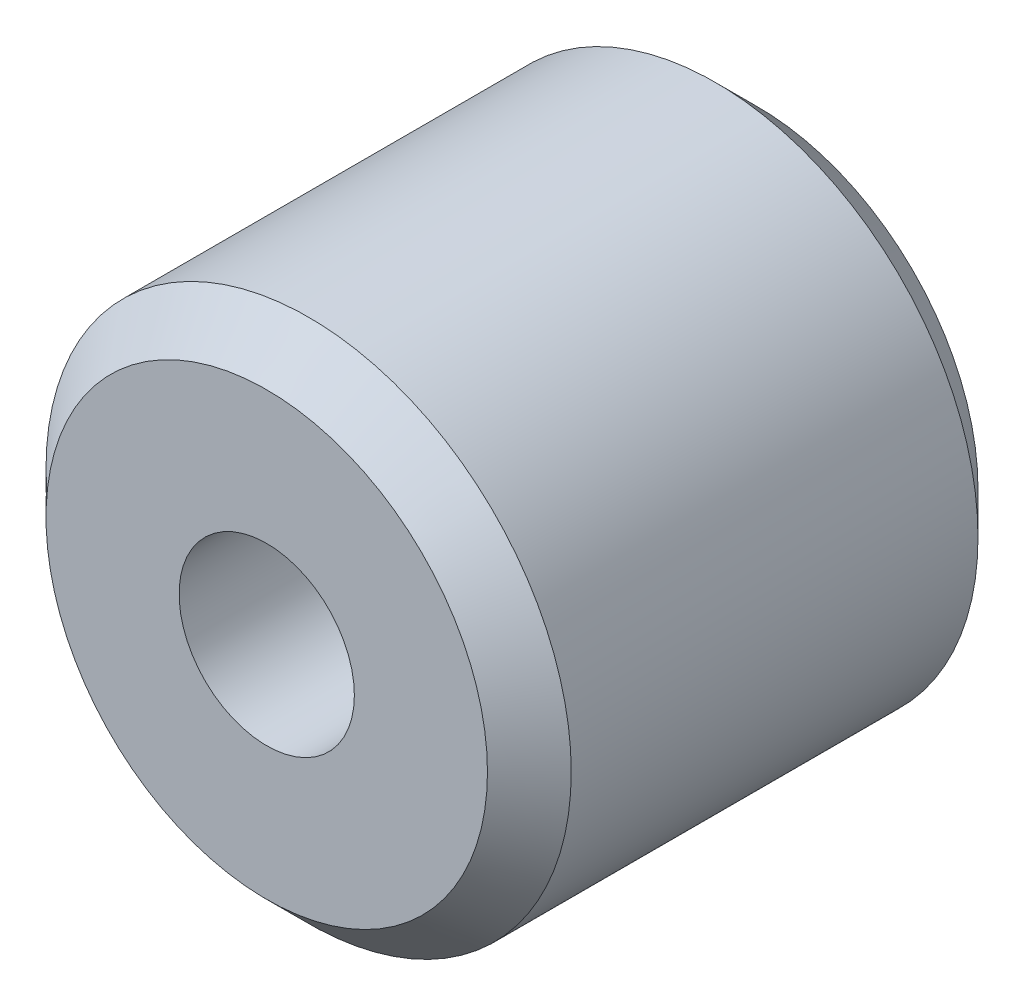
ISO-10303-21;
HEADER;
FILE_DESCRIPTION(('STEP AP214'),'2;1');
FILE_NAME('part.step','',(''),(''),'','','');
FILE_SCHEMA(('AUTOMOTIVE_DESIGN { 1 0 10303 214 1 1 1 1 }'));
ENDSEC;
DATA;
#1=APPLICATION_CONTEXT('core data for automotive mechanical design processes');
#2=APPLICATION_PROTOCOL_DEFINITION('international standard','automotive_design',2000,#1);
#3=PRODUCT_CONTEXT('',#1,'mechanical');
#4=PRODUCT('Part','Part','',(#3));
#5=PRODUCT_RELATED_PRODUCT_CATEGORY('part','',(#4));
#6=PRODUCT_DEFINITION_FORMATION('','',#4);
#7=PRODUCT_DEFINITION_CONTEXT('part definition',#1,'design');
#8=PRODUCT_DEFINITION('design','',#6,#7);
#9=PRODUCT_DEFINITION_SHAPE('','',#8);
#10=(LENGTH_UNIT() NAMED_UNIT(*) SI_UNIT(.MILLI.,.METRE.));
#11=(NAMED_UNIT(*) PLANE_ANGLE_UNIT() SI_UNIT($,.RADIAN.));
#12=(NAMED_UNIT(*) SI_UNIT($,.STERADIAN.) SOLID_ANGLE_UNIT());
#13=UNCERTAINTY_MEASURE_WITH_UNIT(LENGTH_MEASURE(1.E-05),#10,'distance_accuracy_value','');
#14=(GEOMETRIC_REPRESENTATION_CONTEXT(3) GLOBAL_UNCERTAINTY_ASSIGNED_CONTEXT((#13)) GLOBAL_UNIT_ASSIGNED_CONTEXT((#10,
#11,#12)) REPRESENTATION_CONTEXT('',''));
#15=CARTESIAN_POINT('',(0.,0.,0.));
#16=DIRECTION('',(0.,0.,1.));
#17=DIRECTION('',(1.,0.,0.));
#18=AXIS2_PLACEMENT_3D('',#15,#16,#17);
#19=CARTESIAN_POINT('',(0.,0.,4.45));
#20=DIRECTION('',(0.,0.,1.));
#21=DIRECTION('',(1.,0.,0.));
#22=AXIS2_PLACEMENT_3D('',#19,#20,#21);
#23=PLANE('',#22);
#24=CARTESIAN_POINT('',(0.,0.,4.45));
#25=DIRECTION('',(0.,0.,1.));
#26=DIRECTION('',(1.,0.,0.));
#27=AXIS2_PLACEMENT_3D('',#24,#25,#26);
#28=CIRCLE('',#27,4.005);
#29=CARTESIAN_POINT('',(4.005,0.,4.45));
#30=VERTEX_POINT('',#29);
#31=EDGE_CURVE('E10',#30,#30,#28,.T.);
#32=ORIENTED_EDGE('',*,*,#31,.T.);
#33=EDGE_LOOP('',(#32));
#34=FACE_BOUND('',#33,.T.);
#35=CARTESIAN_POINT('',(0.,0.,4.45));
#36=DIRECTION('',(0.,0.,1.));
#37=DIRECTION('',(1.,0.,0.));
#38=AXIS2_PLACEMENT_3D('',#35,#36,#37);
#39=CIRCLE('',#38,1.59);
#40=CARTESIAN_POINT('',(1.59,0.,4.45));
#41=VERTEX_POINT('',#40);
#42=EDGE_CURVE('E62',#41,#41,#39,.T.);
#43=ORIENTED_EDGE('',*,*,#42,.F.);
#44=EDGE_LOOP('',(#43));
#45=FACE_BOUND('',#44,.T.);
#46=ADVANCED_FACE('F41',(#34,#45),#23,.T.);
#47=CARTESIAN_POINT('',(0.,0.,-4.45));
#48=DIRECTION('',(0.,0.,1.));
#49=DIRECTION('',(1.,0.,0.));
#50=AXIS2_PLACEMENT_3D('',#47,#48,#49);
#51=PLANE('',#50);
#52=CARTESIAN_POINT('',(0.,0.,-4.45));
#53=DIRECTION('',(0.,0.,1.));
#54=DIRECTION('',(1.,0.,0.));
#55=AXIS2_PLACEMENT_3D('',#52,#53,#54);
#56=CIRCLE('',#55,4.005);
#57=CARTESIAN_POINT('',(4.005,0.,-4.45));
#58=VERTEX_POINT('',#57);
#59=EDGE_CURVE('E49',#58,#58,#56,.F.);
#60=ORIENTED_EDGE('',*,*,#59,.T.);
#61=EDGE_LOOP('',(#60));
#62=FACE_BOUND('',#61,.T.);
#63=CARTESIAN_POINT('',(0.,0.,-4.45));
#64=DIRECTION('',(0.,0.,1.));
#65=DIRECTION('',(1.,0.,0.));
#66=AXIS2_PLACEMENT_3D('',#63,#64,#65);
#67=CIRCLE('',#66,1.59);
#68=CARTESIAN_POINT('',(1.59,0.,-4.45));
#69=VERTEX_POINT('',#68);
#70=EDGE_CURVE('E63',#69,#69,#67,.T.);
#71=ORIENTED_EDGE('',*,*,#70,.T.);
#72=EDGE_LOOP('',(#71));
#73=FACE_BOUND('',#72,.T.);
#74=ADVANCED_FACE('F73',(#62,#73),#51,.F.);
#75=CARTESIAN_POINT('',(0.,0.,4.45));
#76=DIRECTION('',(0.,0.,-1.));
#77=DIRECTION('',(-1.,0.,0.));
#78=AXIS2_PLACEMENT_3D('',#75,#76,#77);
#79=CYLINDRICAL_SURFACE('',#78,4.765);
#80=CARTESIAN_POINT('',(0.,0.,-3.69));
#81=DIRECTION('',(0.,0.,1.));
#82=DIRECTION('',(1.,0.,0.));
#83=AXIS2_PLACEMENT_3D('',#80,#81,#82);
#84=CIRCLE('',#83,4.765);
#85=CARTESIAN_POINT('',(4.765,0.,-3.69));
#86=VERTEX_POINT('',#85);
#87=EDGE_CURVE('E53',#86,#86,#84,.T.);
#88=ORIENTED_EDGE('',*,*,#87,.T.);
#89=EDGE_LOOP('',(#88));
#90=FACE_BOUND('',#89,.T.);
#91=CARTESIAN_POINT('',(0.,0.,3.69));
#92=DIRECTION('',(0.,0.,1.));
#93=DIRECTION('',(1.,0.,0.));
#94=AXIS2_PLACEMENT_3D('',#91,#92,#93);
#95=CIRCLE('',#94,4.765);
#96=CARTESIAN_POINT('',(4.765,0.,3.69));
#97=VERTEX_POINT('',#96);
#98=EDGE_CURVE('E57',#97,#97,#95,.F.);
#99=ORIENTED_EDGE('',*,*,#98,.T.);
#100=EDGE_LOOP('',(#99));
#101=FACE_BOUND('',#100,.T.);
#102=ADVANCED_FACE('F78',(#90,#101),#79,.T.);
#103=CARTESIAN_POINT('',(0.,0.,4.45));
#104=DIRECTION('',(0.,0.,-1.));
#105=DIRECTION('',(-1.,0.,0.));
#106=AXIS2_PLACEMENT_3D('',#103,#104,#105);
#107=CYLINDRICAL_SURFACE('',#106,1.59);
#108=ORIENTED_EDGE('',*,*,#42,.T.);
#109=EDGE_LOOP('',(#108));
#110=FACE_BOUND('',#109,.T.);
#111=ORIENTED_EDGE('',*,*,#70,.F.);
#112=EDGE_LOOP('',(#111));
#113=FACE_BOUND('',#112,.T.);
#114=ADVANCED_FACE('F69',(#110,#113),#107,.F.);
#115=CARTESIAN_POINT('',(0.,0.,-3.69));
#116=DIRECTION('',(0.,0.,1.));
#117=DIRECTION('',(1.,0.,0.));
#118=AXIS2_PLACEMENT_3D('',#115,#116,#117);
#119=CONICAL_SURFACE('',#118,4.765,0.785398163397449);
#120=ORIENTED_EDGE('',*,*,#59,.F.);
#121=EDGE_LOOP('',(#120));
#122=FACE_BOUND('',#121,.T.);
#123=ORIENTED_EDGE('',*,*,#87,.F.);
#124=EDGE_LOOP('',(#123));
#125=FACE_BOUND('',#124,.T.);
#126=ADVANCED_FACE('F85',(#122,#125),#119,.T.);
#127=CARTESIAN_POINT('',(0.,0.,4.45));
#128=DIRECTION('',(0.,0.,-1.));
#129=DIRECTION('',(-1.,0.,0.));
#130=AXIS2_PLACEMENT_3D('',#127,#128,#129);
#131=CONICAL_SURFACE('',#130,4.005,0.785398163397449);
#132=ORIENTED_EDGE('',*,*,#98,.F.);
#133=EDGE_LOOP('',(#132));
#134=FACE_BOUND('',#133,.T.);
#135=ORIENTED_EDGE('',*,*,#31,.F.);
#136=EDGE_LOOP('',(#135));
#137=FACE_BOUND('',#136,.T.);
#138=ADVANCED_FACE('F44',(#134,#137),#131,.T.);
#139=CLOSED_SHELL('',(#46,#74,#102,#114,#126,#138));
#140=MANIFOLD_SOLID_BREP('B2',#139);
#141=ADVANCED_BREP_SHAPE_REPRESENTATION('',(#18,#140),#14);
#142=SHAPE_DEFINITION_REPRESENTATION(#9,#141);
ENDSEC;
END-ISO-10303-21;
